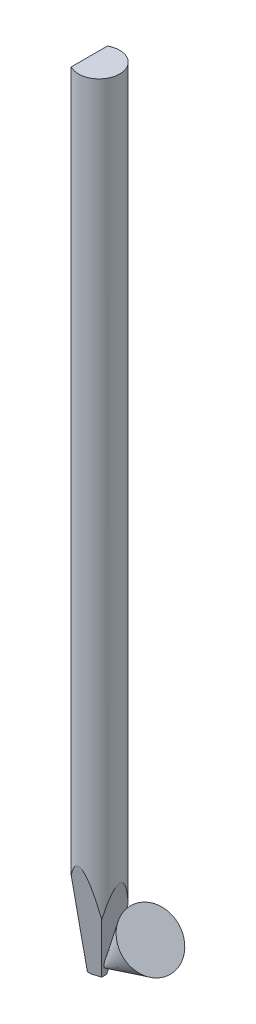
ISO-10303-21;
HEADER;
FILE_DESCRIPTION(('STEP AP214'),'2;1');
FILE_NAME('part.step','',(''),(''),'','','');
FILE_SCHEMA(('AUTOMOTIVE_DESIGN { 1 0 10303 214 1 1 1 1 }'));
ENDSEC;
DATA;
#1=APPLICATION_CONTEXT('core data for automotive mechanical design processes');
#2=APPLICATION_PROTOCOL_DEFINITION('international standard','automotive_design',2000,#1);
#3=PRODUCT_CONTEXT('',#1,'mechanical');
#4=PRODUCT('Part','Part','',(#3));
#5=PRODUCT_RELATED_PRODUCT_CATEGORY('part','',(#4));
#6=PRODUCT_DEFINITION_FORMATION('','',#4);
#7=PRODUCT_DEFINITION_CONTEXT('part definition',#1,'design');
#8=PRODUCT_DEFINITION('design','',#6,#7);
#9=PRODUCT_DEFINITION_SHAPE('','',#8);
#10=(LENGTH_UNIT() NAMED_UNIT(*) SI_UNIT(.MILLI.,.METRE.));
#11=(NAMED_UNIT(*) PLANE_ANGLE_UNIT() SI_UNIT($,.RADIAN.));
#12=(NAMED_UNIT(*) SI_UNIT($,.STERADIAN.) SOLID_ANGLE_UNIT());
#13=UNCERTAINTY_MEASURE_WITH_UNIT(LENGTH_MEASURE(1.E-05),#10,'distance_accuracy_value','');
#14=(GEOMETRIC_REPRESENTATION_CONTEXT(3) GLOBAL_UNCERTAINTY_ASSIGNED_CONTEXT((#13)) GLOBAL_UNIT_ASSIGNED_CONTEXT((#10,
#11,#12)) REPRESENTATION_CONTEXT('',''));
#15=CARTESIAN_POINT('',(0.,0.,0.));
#16=DIRECTION('',(0.,0.,1.));
#17=DIRECTION('',(1.,0.,0.));
#18=AXIS2_PLACEMENT_3D('',#15,#16,#17);
#19=CARTESIAN_POINT('',(0.,0.,0.));
#20=DIRECTION('',(0.,1.,0.));
#21=DIRECTION('',(0.,0.,1.));
#22=AXIS2_PLACEMENT_3D('',#19,#20,#21);
#23=PLANE('',#22);
#24=DIRECTION('',(-1.,0.,0.));
#25=VECTOR('',#24,1.);
#26=CARTESIAN_POINT('',(38.5858213378097,0.,0.0305592719154106));
#27=LINE('',#26,#25);
#28=CARTESIAN_POINT('',(-0.251519873787034,0.,0.0305592719154106));
#29=VERTEX_POINT('',#28);
#30=CARTESIAN_POINT('',(-0.32512,0.,0.0305592719154132));
#31=VERTEX_POINT('',#30);
#32=EDGE_CURVE('E73',#29,#31,#27,.T.);
#33=ORIENTED_EDGE('',*,*,#32,.F.);
#34=CARTESIAN_POINT('',(-0.225245909487751,0.,0.));
#35=DIRECTION('',(0.,1.,0.));
#36=DIRECTION('',(-1.,0.,0.));
#37=AXIS2_PLACEMENT_3D('',#34,#35,#36);
#38=ELLIPSE('',#37,0.0439940905122496,0.0381);
#39=CARTESIAN_POINT('',(-0.2413,0.,0.0354726603649658));
#40=VERTEX_POINT('',#39);
#41=EDGE_CURVE('E66',#40,#29,#38,.F.);
#42=ORIENTED_EDGE('',*,*,#41,.F.);
#43=DIRECTION('',(0.,0.,-1.));
#44=VECTOR('',#43,1.);
#45=CARTESIAN_POINT('',(-0.2413,0.,39.0514777293349));
#46=LINE('',#45,#44);
#47=CARTESIAN_POINT('',(-0.241300000000003,0.,0.0761999999999997));
#48=VERTEX_POINT('',#47);
#49=EDGE_CURVE('E208',#48,#40,#46,.T.);
#50=ORIENTED_EDGE('',*,*,#49,.F.);
#51=DIRECTION('',(-1.,0.,0.));
#52=VECTOR('',#51,1.);
#53=CARTESIAN_POINT('',(38.6493213378097,0.,0.0762));
#54=LINE('',#53,#52);
#55=CARTESIAN_POINT('',(-0.32512,0.,0.0762000000000017));
#56=VERTEX_POINT('',#55);
#57=EDGE_CURVE('E220',#48,#56,#54,.T.);
#58=ORIENTED_EDGE('',*,*,#57,.T.);
#59=DIRECTION('',(0.,0.,-1.));
#60=VECTOR('',#59,1.);
#61=CARTESIAN_POINT('',(-0.32512,0.,38.2746713378097));
#62=LINE('',#61,#60);
#63=EDGE_CURVE('E195',#56,#31,#62,.T.);
#64=ORIENTED_EDGE('',*,*,#63,.T.);
#65=EDGE_LOOP('',(#33,#42,#50,#58,#64));
#66=FACE_BOUND('',#65,.T.);
#67=ADVANCED_FACE('F51',(#66),#23,.F.);
#68=CARTESIAN_POINT('',(38.6493213378097,0.,0.0762));
#69=DIRECTION('',(0.,-0.173648177666931,0.984807753012208));
#70=DIRECTION('',(0.,-0.984807753012208,-0.173648177666931));
#71=AXIS2_PLACEMENT_3D('',#68,#69,#70);
#72=PLANE('',#71);
#73=CARTESIAN_POINT('',(-0.32512,0.0508,0.0851574106199918));
#74=DIRECTION('',(0.,-0.173648177666931,0.984807753012208));
#75=DIRECTION('',(0.,-0.984807753012208,-0.173648177666931));
#76=AXIS2_PLACEMENT_3D('',#73,#74,#75);
#77=ELLIPSE('',#76,0.0515836718837959,0.0508);
#78=CARTESIAN_POINT('',(-0.37592,0.0508,0.0851574106199918));
#79=VERTEX_POINT('',#78);
#80=EDGE_CURVE('E198',#56,#79,#77,.F.);
#81=ORIENTED_EDGE('',*,*,#80,.F.);
#82=ORIENTED_EDGE('',*,*,#57,.F.);
#83=DIRECTION('',(-0.964921520309631,-0.258549942126377,-0.0455893306574928));
#84=VECTOR('',#83,1.);
#85=CARTESIAN_POINT('',(35.9687284956643,9.70244789332123,1.78700334251055));
#86=LINE('',#85,#84);
#87=CARTESIAN_POINT('',(0.195917050620486,0.117151955630876,0.0968570506204847));
#88=VERTEX_POINT('',#87);
#89=EDGE_CURVE('E217',#88,#48,#86,.T.);
#90=ORIENTED_EDGE('',*,*,#89,.F.);
#91=DIRECTION('',(-0.171087869746036,-0.970287525247814,-0.171087869746036));
#92=VECTOR('',#91,1.);
#93=CARTESIAN_POINT('',(1.30143652609224,6.3868644581071,1.20237652609224));
#94=LINE('',#93,#92);
#95=CARTESIAN_POINT('',(0.607704752474526,2.45251606269785,0.508644752474526));
#96=VERTEX_POINT('',#95);
#97=EDGE_CURVE('E214',#96,#88,#94,.T.);
#98=ORIENTED_EDGE('',*,*,#97,.F.);
#99=CARTESIAN_POINT('',(0.,-0.432151674654869,0.));
#100=DIRECTION('',(0.,-0.173648177666931,0.984807753012208));
#101=DIRECTION('',(0.,-0.984807753012208,-0.173648177666931));
#102=AXIS2_PLACEMENT_3D('',#99,#100,#101);
#103=ELLIPSE('',#102,4.56371043248163,0.792479999999998);
#104=CARTESIAN_POINT('',(-0.37592,3.52439037249586,0.69764511322018));
#105=VERTEX_POINT('',#104);
#106=EDGE_CURVE('E226',#96,#105,#103,.T.);
#107=ORIENTED_EDGE('',*,*,#106,.T.);
#108=DIRECTION('',(0.,0.984807753012208,0.173648177666931));
#109=VECTOR('',#108,1.);
#110=CARTESIAN_POINT('',(-0.37592,29.3689259535228,5.25473404003518));
#111=LINE('',#110,#109);
#112=EDGE_CURVE('E241',#79,#105,#111,.T.);
#113=ORIENTED_EDGE('',*,*,#112,.F.);
#114=EDGE_LOOP('',(#81,#82,#90,#98,#107,#113));
#115=FACE_BOUND('',#114,.T.);
#116=ADVANCED_FACE('F296',(#115),#72,.T.);
#117=CARTESIAN_POINT('',(38.6493213378097,0.,-0.0762));
#118=DIRECTION('',(0.,-0.173648177666931,-0.984807753012208));
#119=DIRECTION('',(0.,0.984807753012208,-0.173648177666931));
#120=AXIS2_PLACEMENT_3D('',#117,#118,#119);
#121=PLANE('',#120);
#122=CARTESIAN_POINT('',(-0.32512,0.0508,-0.0851574106199918));
#123=DIRECTION('',(0.,-0.173648177666931,-0.984807753012208));
#124=DIRECTION('',(0.,0.984807753012208,-0.173648177666931));
#125=AXIS2_PLACEMENT_3D('',#122,#123,#124);
#126=ELLIPSE('',#125,0.0515836718837959,0.0508);
#127=CARTESIAN_POINT('',(-0.37592,0.0508,-0.0851574106199918));
#128=VERTEX_POINT('',#127);
#129=CARTESIAN_POINT('',(-0.32512,0.,-0.0761999999999985));
#130=VERTEX_POINT('',#129);
#131=EDGE_CURVE('E252',#128,#130,#126,.F.);
#132=ORIENTED_EDGE('',*,*,#131,.F.);
#133=DIRECTION('',(0.,-0.984807753012208,0.173648177666931));
#134=VECTOR('',#133,1.);
#135=CARTESIAN_POINT('',(-0.37592,29.7268431931102,-5.31784450623514));
#136=LINE('',#135,#134);
#137=CARTESIAN_POINT('',(-0.37592,3.52439037249585,-0.69764511322018));
#138=VERTEX_POINT('',#137);
#139=EDGE_CURVE('E243',#138,#128,#136,.T.);
#140=ORIENTED_EDGE('',*,*,#139,.F.);
#141=CARTESIAN_POINT('',(0.,-0.432151674654869,0.));
#142=DIRECTION('',(0.,-0.173648177666931,-0.984807753012208));
#143=DIRECTION('',(0.,-0.984807753012208,0.173648177666931));
#144=AXIS2_PLACEMENT_3D('',#141,#142,#143);
#145=ELLIPSE('',#144,4.56371043248163,0.792479999999998);
#146=CARTESIAN_POINT('',(0.607704752474526,2.45251606269785,-0.508644752474526));
#147=VERTEX_POINT('',#146);
#148=EDGE_CURVE('E229',#138,#147,#145,.T.);
#149=ORIENTED_EDGE('',*,*,#148,.T.);
#150=DIRECTION('',(0.171087869746036,0.970287525247814,-0.171087869746036));
#151=VECTOR('',#150,1.);
#152=CARTESIAN_POINT('',(1.30143652609224,6.3868644581071,-1.20237652609224));
#153=LINE('',#152,#151);
#154=CARTESIAN_POINT('',(0.195917050620486,0.117151955630876,-0.0968570506204847));
#155=VERTEX_POINT('',#154);
#156=EDGE_CURVE('E246',#155,#147,#153,.T.);
#157=ORIENTED_EDGE('',*,*,#156,.F.);
#158=DIRECTION('',(0.964921520309631,0.258549942126377,-0.0455893306574928));
#159=VECTOR('',#158,1.);
#160=CARTESIAN_POINT('',(35.9687284956643,9.70244789332123,-1.78700334251055));
#161=LINE('',#160,#159);
#162=CARTESIAN_POINT('',(-0.241300000000003,0.,-0.0761999999999997));
#163=VERTEX_POINT('',#162);
#164=EDGE_CURVE('E249',#163,#155,#161,.T.);
#165=ORIENTED_EDGE('',*,*,#164,.F.);
#166=DIRECTION('',(-1.,0.,0.));
#167=VECTOR('',#166,1.);
#168=CARTESIAN_POINT('',(38.6493213378097,0.,-0.0762));
#169=LINE('',#168,#167);
#170=EDGE_CURVE('E223',#163,#130,#169,.T.);
#171=ORIENTED_EDGE('',*,*,#170,.T.);
#172=EDGE_LOOP('',(#132,#140,#149,#157,#165,#171));
#173=FACE_BOUND('',#172,.T.);
#174=ADVANCED_FACE('F302',(#173),#121,.T.);
#175=CARTESIAN_POINT('',(-0.2413,0.,-0.0354726603649658));
#176=VERTEX_POINT('',#175);
#177=EDGE_CURVE('E207',#176,#163,#46,.T.);
#178=ORIENTED_EDGE('',*,*,#177,.F.);
#179=CARTESIAN_POINT('',(-0.251519873787034,0.,-0.0305592719154105));
#180=VERTEX_POINT('',#179);
#181=EDGE_CURVE('E185',#180,#176,#38,.F.);
#182=ORIENTED_EDGE('',*,*,#181,.F.);
#183=DIRECTION('',(-1.,0.,0.));
#184=VECTOR('',#183,1.);
#185=CARTESIAN_POINT('',(38.5858213378097,0.,-0.0305592719154106));
#186=LINE('',#185,#184);
#187=CARTESIAN_POINT('',(-0.325119999999998,0.,-0.0305592719154106));
#188=VERTEX_POINT('',#187);
#189=EDGE_CURVE('E191',#180,#188,#186,.T.);
#190=ORIENTED_EDGE('',*,*,#189,.T.);
#191=EDGE_CURVE('E199',#188,#130,#62,.T.);
#192=ORIENTED_EDGE('',*,*,#191,.T.);
#193=ORIENTED_EDGE('',*,*,#170,.F.);
#194=EDGE_LOOP('',(#178,#182,#190,#192,#193));
#195=FACE_BOUND('',#194,.T.);
#196=ADVANCED_FACE('F298',(#195),#23,.F.);
#197=CARTESIAN_POINT('',(0.,30.48,0.));
#198=DIRECTION('',(0.,-1.,0.));
#199=DIRECTION('',(0.,0.,-1.));
#200=AXIS2_PLACEMENT_3D('',#197,#198,#199);
#201=CYLINDRICAL_SURFACE('',#200,0.792479999999998);
#202=ORIENTED_EDGE('',*,*,#106,.F.);
#203=CARTESIAN_POINT('',(0.,-0.993948851706197,0.));
#204=DIRECTION('',(-0.984807753012208,0.173648177666931,0.));
#205=DIRECTION('',(-0.173648177666931,-0.984807753012208,0.));
#206=AXIS2_PLACEMENT_3D('',#203,#204,#205);
#207=ELLIPSE('',#206,4.56371043248165,0.792479999999998);
#208=EDGE_CURVE('E211',#96,#147,#207,.T.);
#209=ORIENTED_EDGE('',*,*,#208,.T.);
#210=ORIENTED_EDGE('',*,*,#148,.F.);
#211=DIRECTION('',(0.,-1.,0.));
#212=VECTOR('',#211,1.);
#213=CARTESIAN_POINT('',(-0.37592,30.48,-0.69764511322018));
#214=LINE('',#213,#212);
#215=CARTESIAN_POINT('',(-0.37592,30.48,-0.69764511322018));
#216=VERTEX_POINT('',#215);
#217=EDGE_CURVE('E235',#216,#138,#214,.T.);
#218=ORIENTED_EDGE('',*,*,#217,.F.);
#219=CARTESIAN_POINT('',(0.,30.48,0.));
#220=DIRECTION('',(0.,1.,0.));
#221=DIRECTION('',(0.,0.,1.));
#222=AXIS2_PLACEMENT_3D('',#219,#220,#221);
#223=CIRCLE('',#222,0.792479999999998);
#224=CARTESIAN_POINT('',(-0.37592,30.48,0.69764511322018));
#225=VERTEX_POINT('',#224);
#226=EDGE_CURVE('E238',#225,#216,#223,.T.);
#227=ORIENTED_EDGE('',*,*,#226,.F.);
#228=DIRECTION('',(0.,-1.,0.));
#229=VECTOR('',#228,1.);
#230=CARTESIAN_POINT('',(-0.37592,30.48,0.69764511322018));
#231=LINE('',#230,#229);
#232=EDGE_CURVE('E233',#105,#225,#231,.F.);
#233=ORIENTED_EDGE('',*,*,#232,.F.);
#234=EDGE_LOOP('',(#202,#209,#210,#218,#227,#233));
#235=FACE_BOUND('',#234,.T.);
#236=ADVANCED_FACE('F53',(#235),#201,.T.);
#237=CARTESIAN_POINT('',(-0.37592,30.48,-1.04648));
#238=DIRECTION('',(-1.,0.,0.));
#239=DIRECTION('',(0.,0.,1.));
#240=AXIS2_PLACEMENT_3D('',#237,#238,#239);
#241=PLANE('',#240);
#242=DIRECTION('',(0.,0.,-1.));
#243=VECTOR('',#242,1.);
#244=CARTESIAN_POINT('',(-0.37592,0.0508,38.2746713378097));
#245=LINE('',#244,#243);
#246=EDGE_CURVE('E193',#79,#128,#245,.T.);
#247=ORIENTED_EDGE('',*,*,#246,.F.);
#248=ORIENTED_EDGE('',*,*,#112,.T.);
#249=ORIENTED_EDGE('',*,*,#232,.T.);
#250=DIRECTION('',(0.,0.,-1.));
#251=VECTOR('',#250,1.);
#252=CARTESIAN_POINT('',(-0.37592,30.48,-1.04648));
#253=LINE('',#252,#251);
#254=EDGE_CURVE('E231',#225,#216,#253,.T.);
#255=ORIENTED_EDGE('',*,*,#254,.T.);
#256=ORIENTED_EDGE('',*,*,#217,.T.);
#257=ORIENTED_EDGE('',*,*,#139,.T.);
#258=EDGE_LOOP('',(#247,#248,#249,#255,#256,#257));
#259=FACE_BOUND('',#258,.T.);
#260=ADVANCED_FACE('F312',(#259),#241,.T.);
#261=CARTESIAN_POINT('',(0.,30.48,0.));
#262=DIRECTION('',(0.,1.,0.));
#263=DIRECTION('',(0.,0.,1.));
#264=AXIS2_PLACEMENT_3D('',#261,#262,#263);
#265=PLANE('',#264);
#266=ORIENTED_EDGE('',*,*,#226,.T.);
#267=ORIENTED_EDGE('',*,*,#254,.F.);
#268=EDGE_LOOP('',(#266,#267));
#269=FACE_BOUND('',#268,.T.);
#270=ADVANCED_FACE('F344',(#269),#265,.T.);
#271=CARTESIAN_POINT('',(-0.2413,0.,39.0514777293349));
#272=DIRECTION('',(-0.258819045102522,0.965925826289068,0.));
#273=DIRECTION('',(-0.965925826289068,-0.258819045102522,0.));
#274=AXIS2_PLACEMENT_3D('',#271,#272,#273);
#275=PLANE('',#274);
#276=ORIENTED_EDGE('',*,*,#49,.T.);
#277=CARTESIAN_POINT('',(-0.222307807006681,0.00508894277505577,0.));
#278=DIRECTION('',(-0.258819045102522,0.965925826289068,0.));
#279=DIRECTION('',(-0.965925826289068,-0.258819045102522,0.));
#280=AXIS2_PLACEMENT_3D('',#277,#278,#279);
#281=ELLIPSE('',#280,0.0538815367264152,0.0381);
#282=CARTESIAN_POINT('',(-0.222307807006681,0.00508894277505577,0.0380999999999996));
#283=VERTEX_POINT('',#282);
#284=EDGE_CURVE('E190',#40,#283,#281,.T.);
#285=ORIENTED_EDGE('',*,*,#284,.T.);
#286=DIRECTION('',(-0.965925826289068,-0.258819045102522,0.));
#287=VECTOR('',#286,1.);
#288=CARTESIAN_POINT('',(-0.2413,0.,0.0380999999999992));
#289=LINE('',#288,#287);
#290=CARTESIAN_POINT('',(-0.0152400000000001,0.0605725944409798,0.0380999999999996));
#291=VERTEX_POINT('',#290);
#292=EDGE_CURVE('E12',#291,#283,#289,.T.);
#293=ORIENTED_EDGE('',*,*,#292,.F.);
#294=DIRECTION('',(0.,0.,1.));
#295=VECTOR('',#294,1.);
#296=CARTESIAN_POINT('',(-0.0152400000000001,0.0605725944409798,39.0514777293349));
#297=LINE('',#296,#295);
#298=CARTESIAN_POINT('',(-0.0152400000000001,0.0605725944409798,-0.0380999999999996));
#299=VERTEX_POINT('',#298);
#300=EDGE_CURVE('E59',#299,#291,#297,.T.);
#301=ORIENTED_EDGE('',*,*,#300,.F.);
#302=DIRECTION('',(-0.965925826289068,-0.258819045102522,0.));
#303=VECTOR('',#302,1.);
#304=CARTESIAN_POINT('',(-0.2413,0.,-0.0380999999999992));
#305=LINE('',#304,#303);
#306=CARTESIAN_POINT('',(-0.222307807006681,0.0050889427750558,-0.0380999999999996));
#307=VERTEX_POINT('',#306);
#308=EDGE_CURVE('E336',#299,#307,#305,.T.);
#309=ORIENTED_EDGE('',*,*,#308,.T.);
#310=EDGE_CURVE('E187',#307,#176,#281,.T.);
#311=ORIENTED_EDGE('',*,*,#310,.T.);
#312=ORIENTED_EDGE('',*,*,#177,.T.);
#313=ORIENTED_EDGE('',*,*,#164,.T.);
#314=DIRECTION('',(0.,0.,-1.));
#315=VECTOR('',#314,1.);
#316=CARTESIAN_POINT('',(0.195917050620484,0.117151955630877,39.0514777293349));
#317=LINE('',#316,#315);
#318=EDGE_CURVE('E204',#88,#155,#317,.T.);
#319=ORIENTED_EDGE('',*,*,#318,.F.);
#320=ORIENTED_EDGE('',*,*,#89,.T.);
#321=EDGE_LOOP('',(#276,#285,#293,#301,#309,#311,#312,#313,#319,#320));
#322=FACE_BOUND('',#321,.T.);
#323=ADVANCED_FACE('F322',(#322),#275,.F.);
#324=CARTESIAN_POINT('',(0.195917050620484,0.117151955630877,39.0514777293349));
#325=DIRECTION('',(-0.984807753012208,0.173648177666931,0.));
#326=DIRECTION('',(-0.173648177666931,-0.984807753012208,0.));
#327=AXIS2_PLACEMENT_3D('',#324,#325,#326);
#328=PLANE('',#327);
#329=ORIENTED_EDGE('',*,*,#208,.F.);
#330=ORIENTED_EDGE('',*,*,#97,.T.);
#331=ORIENTED_EDGE('',*,*,#318,.T.);
#332=ORIENTED_EDGE('',*,*,#156,.T.);
#333=EDGE_LOOP('',(#329,#330,#331,#332));
#334=FACE_BOUND('',#333,.T.);
#335=ADVANCED_FACE('F328',(#334),#328,.F.);
#336=CARTESIAN_POINT('',(-0.32512,0.0508,38.2746713378097));
#337=DIRECTION('',(0.,0.,-1.));
#338=DIRECTION('',(-1.,0.,0.));
#339=AXIS2_PLACEMENT_3D('',#336,#337,#338);
#340=CYLINDRICAL_SURFACE('',#339,0.0508);
#341=ORIENTED_EDGE('',*,*,#191,.F.);
#342=CARTESIAN_POINT('',(-0.32512,0.,-0.0305592719154107));
#343=CARTESIAN_POINT('',(-0.325858236957676,-5.53108021334955E-07,-0.0305607259657637));
#344=CARTESIAN_POINT('',(-0.326594924621043,1.60714157369838E-05,-0.030495838437188));
#345=CARTESIAN_POINT('',(-0.328040853257545,7.90646741498496E-05,-0.0302458657079433));
#346=CARTESIAN_POINT('',(-0.328750258605012,0.000125209460070392,-0.0300616853651177));
#347=CARTESIAN_POINT('',(-0.330127335420077,0.000242622000986335,-0.0295858263774232));
#348=CARTESIAN_POINT('',(-0.330795098367709,0.000313832226151643,-0.0292943938271016));
#349=CARTESIAN_POINT('',(-0.332081382661914,0.000475060487819713,-0.0286204959071945));
#350=CARTESIAN_POINT('',(-0.33269980461648,0.000565115225959678,-0.0282378526900317));
#351=CARTESIAN_POINT('',(-0.334192076916493,0.000808265513491711,-0.0271773481608598));
#352=CARTESIAN_POINT('',(-0.335029445523832,0.000969625818726419,-0.026449998329407));
#353=CARTESIAN_POINT('',(-0.336575792501105,0.00130219785271696,-0.0248718599859349));
#354=CARTESIAN_POINT('',(-0.337284466615557,0.00147343169781167,-0.0240207873021354));
#355=CARTESIAN_POINT('',(-0.338902404052553,0.00189503390088372,-0.0217907775086764));
#356=CARTESIAN_POINT('',(-0.339738409671651,0.00214281434683637,-0.0203583966577251));
#357=CARTESIAN_POINT('',(-0.341181516405416,0.00260006341315772,-0.0173784393482932));
#358=CARTESIAN_POINT('',(-0.341788196439286,0.00280946119692794,-0.0158306571698745));
#359=CARTESIAN_POINT('',(-0.343030492504762,0.00325551023908127,-0.0119583187225397));
#360=CARTESIAN_POINT('',(-0.343557981079327,0.00346255354596887,-0.00959561821404047));
#361=CARTESIAN_POINT('',(-0.344255063125309,0.00374027266049538,-0.00480965423124057));
#362=CARTESIAN_POINT('',(-0.344424048346478,0.00381071669129823,-0.00238629487582548));
#363=CARTESIAN_POINT('',(-0.344420543476751,0.00380925599007635,0.00251505351649139));
#364=CARTESIAN_POINT('',(-0.344240242551909,0.0037340952025175,0.00499303829877786));
#365=CARTESIAN_POINT('',(-0.343503116072386,0.00344102376156785,0.00988250616835363));
#366=CARTESIAN_POINT('',(-0.342947115283489,0.00322342583000905,0.0122941229082296));
#367=CARTESIAN_POINT('',(-0.341697445915377,0.00277844131593357,0.016056371412867));
#368=CARTESIAN_POINT('',(-0.341140010592968,0.00258733328064085,0.0174568664144533));
#369=CARTESIAN_POINT('',(-0.339836340225262,0.00217343538605201,0.0201631357921833));
#370=CARTESIAN_POINT('',(-0.339090355440518,0.00195068769220773,0.0214690327945598));
#371=CARTESIAN_POINT('',(-0.337609435516471,0.00155498403693321,0.0236026339752404));
#372=CARTESIAN_POINT('',(-0.336924282362182,0.00138453322303943,0.0244651720087413));
#373=CARTESIAN_POINT('',(-0.33542705825125,0.0010507118126494,0.0260748789279711));
#374=CARTESIAN_POINT('',(-0.334615162267625,0.000887331845947955,0.0268222040835302));
#375=CARTESIAN_POINT('',(-0.333082242888472,0.000623459730751616,0.0279875848202924));
#376=CARTESIAN_POINT('',(-0.332389368131792,0.000517464250346877,0.0284412325054634));
#377=CARTESIAN_POINT('',(-0.330938437738328,0.000329027831212182,0.029232356157943));
#378=CARTESIAN_POINT('',(-0.33018056918255,0.000246522055950193,0.0295701524381499));
#379=CARTESIAN_POINT('',(-0.328714108702929,0.000122711503927056,0.0300716782826988));
#380=CARTESIAN_POINT('',(-0.328011633419792,7.74837851241451E-05,0.0302521582460551));
#381=CARTESIAN_POINT('',(-0.326580079595815,1.57536363226463E-05,0.0304970912352569));
#382=CARTESIAN_POINT('',(-0.325850836216604,-5.21850126766476E-07,0.0305606277269008));
#383=CARTESIAN_POINT('',(-0.32512,0.,0.0305592719154108));
#384=B_SPLINE_CURVE_WITH_KNOTS('',3,(#342,#343,#344,#345,#346,#347,#348,#349,#350,#351,#352,
#353,#354,#355,#356,#357,#358,#359,#360,#361,#362,#363,#364,#365,#366,#367,#368,#369,#370,#371,
#372,#373,#374,#375,#376,#377,#378,#379,#380,#381,#382,#383),.UNSPECIFIED.,.F.,.F.,(4,2,2,2,2,2,
2,2,2,2,2,2,2,2,2,2,2,2,2,2,4),(0.,0.00220921601201936,0.0044018679109023,0.00658951973415581,
0.00878147256575863,0.0121249186025338,0.0154761690271903,0.0204789510156342,0.0254908748496787,
0.0327415829903931,0.0400045831488868,0.047431876503932,0.0548429176275208,0.0593900092119095,
0.0639310968754885,0.0672649817656624,0.0705943041604313,0.0730899945258478,0.0755787279534688,
0.0777487809149595,0.0799357702171768),.UNSPECIFIED.);
#385=EDGE_CURVE('E255',#188,#31,#384,.T.);
#386=ORIENTED_EDGE('',*,*,#385,.T.);
#387=ORIENTED_EDGE('',*,*,#63,.F.);
#388=ORIENTED_EDGE('',*,*,#80,.T.);
#389=ORIENTED_EDGE('',*,*,#246,.T.);
#390=ORIENTED_EDGE('',*,*,#131,.T.);
#391=EDGE_LOOP('',(#341,#386,#387,#388,#389,#390));
#392=FACE_BOUND('',#391,.T.);
#393=ADVANCED_FACE('F270',(#392),#340,.T.);
#394=CARTESIAN_POINT('',(38.5858213378097,-0.12065,0.));
#395=DIRECTION('',(-1.,0.,0.));
#396=DIRECTION('',(0.,0.,1.));
#397=AXIS2_PLACEMENT_3D('',#394,#395,#396);
#398=CYLINDRICAL_SURFACE('',#397,0.12446);
#399=ORIENTED_EDGE('',*,*,#189,.F.);
#400=CARTESIAN_POINT('',(-0.251519873787038,0.,-0.0305592719154107));
#401=CARTESIAN_POINT('',(-0.253212442992812,0.000304680277333505,-0.0293578195118916));
#402=CARTESIAN_POINT('',(-0.254799383675205,0.000626134198396242,-0.0280121689503982));
#403=CARTESIAN_POINT('',(-0.25772228329655,0.00126745613152857,-0.0250730883924893));
#404=CARTESIAN_POINT('',(-0.259058423831709,0.00158732512652685,-0.0234798392140403));
#405=CARTESIAN_POINT('',(-0.261443735881515,0.00219118318869465,-0.0200826579826784));
#406=CARTESIAN_POINT('',(-0.262492625766191,0.00247513689763396,-0.018278521623541));
#407=CARTESIAN_POINT('',(-0.264276327290215,0.00297546630576823,-0.0145133409198431));
#408=CARTESIAN_POINT('',(-0.265011238745263,0.00319186347570833,-0.0125523466771001));
#409=CARTESIAN_POINT('',(-0.266147425091763,0.00353264575175171,-0.00854289992266061));
#410=CARTESIAN_POINT('',(-0.266550928152798,0.00365764472370007,-0.00649513048528557));
#411=CARTESIAN_POINT('',(-0.267024809204912,0.00380489792396705,-0.0023572011474007));
#412=CARTESIAN_POINT('',(-0.267095091623122,0.00382712267499358,-0.000267029257816739));
#413=CARTESIAN_POINT('',(-0.266900669145767,0.0037663398511716,0.0039016878755485));
#414=CARTESIAN_POINT('',(-0.266635079230322,0.00368305425671352,0.00598018784627134));
#415=CARTESIAN_POINT('',(-0.265772584262684,0.00341956377513541,0.0100605650870479));
#416=CARTESIAN_POINT('',(-0.265175741462743,0.00323937709880345,0.0120624566785509));
#417=CARTESIAN_POINT('',(-0.263663582323352,0.00280142383734271,0.0159320890412296));
#418=CARTESIAN_POINT('',(-0.262748378895628,0.00254368476179146,0.017799877091425));
#419=CARTESIAN_POINT('',(-0.260620269096897,0.00197844391390526,0.0213491649092957));
#420=CARTESIAN_POINT('',(-0.25940743302166,0.00167095389773039,0.0230307085288325));
#421=CARTESIAN_POINT('',(-0.257097356009015,0.00112927491374232,0.0257180592770446));
#422=CARTESIAN_POINT('',(-0.256064252772083,0.000898918276607413,0.0267805635862541));
#423=CARTESIAN_POINT('',(-0.253878293866173,0.00044290257303953,0.0287722340022557));
#424=CARTESIAN_POINT('',(-0.252725600359476,0.000217237630852924,0.0297015767029099));
#425=CARTESIAN_POINT('',(-0.251519873788958,6.15792915430749E-13,0.0305592719171859));
#426=B_SPLINE_CURVE_WITH_KNOTS('',3,(#400,#401,#402,#403,#404,#405,#406,#407,#408,#409,#410,
#411,#412,#413,#414,#415,#416,#417,#418,#419,#420,#421,#422,#423,#424,#425),.UNSPECIFIED.,.F.,
.F.,(4,2,2,2,2,2,2,2,2,2,2,2,4),(0.,0.00628618282428541,0.0125677963210613,0.0188555466473261,
0.0251412965684637,0.031384431117364,0.0376293561861969,0.0438907709024222,0.0501510093111432,
0.0564090296853914,0.0626655734417439,0.0671546279045663,0.0716376729340544),.UNSPECIFIED.);
#427=EDGE_CURVE('E263',#180,#29,#426,.T.);
#428=ORIENTED_EDGE('',*,*,#427,.T.);
#429=ORIENTED_EDGE('',*,*,#32,.T.);
#430=ORIENTED_EDGE('',*,*,#385,.F.);
#431=EDGE_LOOP('',(#399,#428,#429,#430));
#432=FACE_BOUND('',#431,.T.);
#433=ADVANCED_FACE('F273',(#432),#398,.F.);
#434=CARTESIAN_POINT('',(-0.0152400000000001,0.20828,0.0381));
#435=DIRECTION('',(-1.,0.,0.));
#436=DIRECTION('',(0.,-1.,0.));
#437=AXIS2_PLACEMENT_3D('',#434,#435,#436);
#438=PLANE('',#437);
#439=ORIENTED_EDGE('',*,*,#300,.T.);
#440=DIRECTION('',(0.,1.,0.));
#441=VECTOR('',#440,1.);
#442=CARTESIAN_POINT('',(-0.0152400000000001,0.20828,0.0381));
#443=LINE('',#442,#441);
#444=CARTESIAN_POINT('',(-0.0152400000000001,0.20828,0.0381));
#445=VERTEX_POINT('',#444);
#446=EDGE_CURVE('E152',#291,#445,#443,.T.);
#447=ORIENTED_EDGE('',*,*,#446,.T.);
#448=DIRECTION('',(0.,0.,-1.));
#449=VECTOR('',#448,1.);
#450=CARTESIAN_POINT('',(-0.0152400000000001,0.20828,0.0381));
#451=LINE('',#450,#449);
#452=CARTESIAN_POINT('',(-0.0152400000000001,0.20828,-0.0381));
#453=VERTEX_POINT('',#452);
#454=EDGE_CURVE('E156',#445,#453,#451,.T.);
#455=ORIENTED_EDGE('',*,*,#454,.T.);
#456=DIRECTION('',(0.,1.,0.));
#457=VECTOR('',#456,1.);
#458=CARTESIAN_POINT('',(-0.0152400000000001,0.20828,-0.0381));
#459=LINE('',#458,#457);
#460=EDGE_CURVE('E175',#299,#453,#459,.T.);
#461=ORIENTED_EDGE('',*,*,#460,.F.);
#462=EDGE_LOOP('',(#439,#447,#455,#461));
#463=FACE_BOUND('',#462,.T.);
#464=ADVANCED_FACE('F154',(#463),#438,.T.);
#465=CARTESIAN_POINT('',(0.,0.,0.0381));
#466=DIRECTION('',(0.,0.,-1.));
#467=DIRECTION('',(-1.,0.,0.));
#468=AXIS2_PLACEMENT_3D('',#465,#466,#467);
#469=PLANE('',#468);
#470=ORIENTED_EDGE('',*,*,#292,.T.);
#471=DIRECTION('',(-0.500000000000004,-0.866025403784436,0.));
#472=VECTOR('',#471,1.);
#473=CARTESIAN_POINT('',(-0.168934432115812,0.0975343398574616,0.0381));
#474=LINE('',#473,#472);
#475=CARTESIAN_POINT('',(-0.104995395420934,0.20828,0.0381));
#476=VERTEX_POINT('',#475);
#477=EDGE_CURVE('E170',#476,#283,#474,.T.);
#478=ORIENTED_EDGE('',*,*,#477,.F.);
#479=DIRECTION('',(-1.,0.,0.));
#480=VECTOR('',#479,1.);
#481=CARTESIAN_POINT('',(-0.148989485933184,0.20828,0.0381));
#482=LINE('',#481,#480);
#483=EDGE_CURVE('E162',#445,#476,#482,.T.);
#484=ORIENTED_EDGE('',*,*,#483,.F.);
#485=ORIENTED_EDGE('',*,*,#446,.F.);
#486=EDGE_LOOP('',(#470,#478,#484,#485));
#487=FACE_BOUND('',#486,.T.);
#488=ADVANCED_FACE('F173',(#487),#469,.T.);
#489=CARTESIAN_POINT('',(0.,0.,-0.0381));
#490=DIRECTION('',(0.,0.,-1.));
#491=DIRECTION('',(-1.,0.,0.));
#492=AXIS2_PLACEMENT_3D('',#489,#490,#491);
#493=PLANE('',#492);
#494=ORIENTED_EDGE('',*,*,#460,.T.);
#495=DIRECTION('',(-1.,0.,0.));
#496=VECTOR('',#495,1.);
#497=CARTESIAN_POINT('',(-0.148989485933184,0.20828,-0.0381));
#498=LINE('',#497,#496);
#499=CARTESIAN_POINT('',(-0.104995395420934,0.20828,-0.0381));
#500=VERTEX_POINT('',#499);
#501=EDGE_CURVE('E169',#453,#500,#498,.T.);
#502=ORIENTED_EDGE('',*,*,#501,.T.);
#503=DIRECTION('',(0.500000000000004,0.866025403784436,0.));
#504=VECTOR('',#503,1.);
#505=CARTESIAN_POINT('',(-0.104995395420934,0.20828,-0.0381));
#506=LINE('',#505,#504);
#507=EDGE_CURVE('E181',#307,#500,#506,.T.);
#508=ORIENTED_EDGE('',*,*,#507,.F.);
#509=ORIENTED_EDGE('',*,*,#308,.F.);
#510=EDGE_LOOP('',(#494,#502,#508,#509));
#511=FACE_BOUND('',#510,.T.);
#512=ADVANCED_FACE('F284',(#511),#493,.F.);
#513=CARTESIAN_POINT('',(-0.104995395420934,0.20828,0.));
#514=DIRECTION('',(-0.500000000000004,-0.866025403784436,0.));
#515=DIRECTION('',(0.866025403784437,-0.500000000000004,0.));
#516=AXIS2_PLACEMENT_3D('',#513,#514,#515);
#517=CYLINDRICAL_SURFACE('',#516,0.0381);
#518=ORIENTED_EDGE('',*,*,#41,.T.);
#519=ORIENTED_EDGE('',*,*,#427,.F.);
#520=ORIENTED_EDGE('',*,*,#181,.T.);
#521=ORIENTED_EDGE('',*,*,#310,.F.);
#522=ORIENTED_EDGE('',*,*,#507,.T.);
#523=CARTESIAN_POINT('',(-0.104995395420934,0.20828,0.));
#524=DIRECTION('',(0.,-1.,0.));
#525=DIRECTION('',(-1.,0.,0.));
#526=AXIS2_PLACEMENT_3D('',#523,#524,#525);
#527=ELLIPSE('',#526,0.0439940905122496,0.0381);
#528=EDGE_CURVE('E183',#500,#476,#527,.F.);
#529=ORIENTED_EDGE('',*,*,#528,.T.);
#530=ORIENTED_EDGE('',*,*,#477,.T.);
#531=ORIENTED_EDGE('',*,*,#284,.F.);
#532=EDGE_LOOP('',(#518,#519,#520,#521,#522,#529,#530,#531));
#533=FACE_BOUND('',#532,.T.);
#534=ADVANCED_FACE('F277',(#533),#517,.F.);
#535=CARTESIAN_POINT('',(-0.148989485933184,0.20828,0.0381));
#536=DIRECTION('',(0.,-1.,0.));
#537=DIRECTION('',(0.,0.,-1.));
#538=AXIS2_PLACEMENT_3D('',#535,#536,#537);
#539=PLANE('',#538);
#540=ORIENTED_EDGE('',*,*,#501,.F.);
#541=ORIENTED_EDGE('',*,*,#454,.F.);
#542=ORIENTED_EDGE('',*,*,#483,.T.);
#543=ORIENTED_EDGE('',*,*,#528,.F.);
#544=EDGE_LOOP('',(#540,#541,#542,#543));
#545=FACE_BOUND('',#544,.T.);
#546=ADVANCED_FACE('F166',(#545),#539,.T.);
#547=CLOSED_SHELL('',(#67,#116,#174,#196,#236,#260,#270,#323,#335,#393,#433,#464,#488,#512,#534,#546));
#548=MANIFOLD_SOLID_BREP('B2',#547);
#549=CARTESIAN_POINT('',(0.207817674108744,0.431337674108742,0.));
#550=DIRECTION('',(0.707106781186551,0.707106781186544,0.));
#551=DIRECTION('',(-0.707106781186544,0.707106781186551,0.));
#552=AXIS2_PLACEMENT_3D('',#549,#550,#551);
#553=CONICAL_SURFACE('',#552,0.0444500000000001,0.392699081698725);
#554=CARTESIAN_POINT('',(1.97558109154122,2.1991010915412,0.));
#555=DIRECTION('',(0.707106781186551,0.707106781186544,0.));
#556=DIRECTION('',(-0.707106781186544,0.707106781186551,0.));
#557=AXIS2_PLACEMENT_3D('',#554,#555,#556);
#558=CIRCLE('',#557,1.07998183486493);
#559=CARTESIAN_POINT('',(1.21191861254994,2.96276357053248,0.));
#560=VERTEX_POINT('',#559);
#561=EDGE_CURVE('E50',#560,#560,#558,.T.);
#562=CARTESIAN_POINT('',(0.207817674108744,0.431337674108742,0.));
#563=DIRECTION('',(0.707106781186551,0.707106781186544,0.));
#564=DIRECTION('',(-0.707106781186544,0.707106781186551,0.));
#565=AXIS2_PLACEMENT_3D('',#562,#563,#564);
#566=CIRCLE('',#565,0.0444500000000001);
#567=CARTESIAN_POINT('',(0.176386777685002,0.462768570532484,0.));
#568=VERTEX_POINT('',#567);
#569=EDGE_CURVE('E492',#568,#568,#566,.T.);
#570=CARTESIAN_POINT('',(1.21191861254994,2.96276357053248,0.));
#571=CARTESIAN_POINT('',(1.20113182260343,2.93672195594915,0.));
#572=CARTESIAN_POINT('',(1.19034503265692,2.91068034136581,0.));
#573=CARTESIAN_POINT('',(1.1687714527639,2.85859711219915,0.));
#574=CARTESIAN_POINT('',(1.15798466281739,2.83255549761581,0.));
#575=CARTESIAN_POINT('',(1.13641108292437,2.78047226844915,0.));
#576=CARTESIAN_POINT('',(1.12562429297786,2.75443065386581,0.));
#577=CARTESIAN_POINT('',(1.10405071308484,2.70234742469915,0.));
#578=CARTESIAN_POINT('',(1.09326392313833,2.67630581011581,0.));
#579=CARTESIAN_POINT('',(1.07169034324531,2.62422258094915,0.));
#580=CARTESIAN_POINT('',(1.0609035532988,2.59818096636582,0.));
#581=CARTESIAN_POINT('',(1.03932997340578,2.54609773719915,0.));
#582=CARTESIAN_POINT('',(1.02854318345927,2.52005612261582,0.));
#583=CARTESIAN_POINT('',(1.00696960356625,2.46797289344915,0.));
#584=CARTESIAN_POINT('',(0.996182813619744,2.44193127886582,0.));
#585=CARTESIAN_POINT('',(0.974609233726724,2.38984804969915,0.));
#586=CARTESIAN_POINT('',(0.963822443780214,2.36380643511581,0.));
#587=CARTESIAN_POINT('',(0.942248863887195,2.31172320594915,0.));
#588=CARTESIAN_POINT('',(0.931462073940685,2.28568159136582,0.));
#589=CARTESIAN_POINT('',(0.909888494047666,2.23359836219915,0.));
#590=CARTESIAN_POINT('',(0.899101704101156,2.20755674761582,0.));
#591=CARTESIAN_POINT('',(0.877528124208136,2.15547351844915,0.));
#592=CARTESIAN_POINT('',(0.866741334261626,2.12943190386582,0.));
#593=CARTESIAN_POINT('',(0.845167754368607,2.07734867469915,0.));
#594=CARTESIAN_POINT('',(0.834380964422097,2.05130706011582,0.));
#595=CARTESIAN_POINT('',(0.812807384529078,1.99922383094915,0.));
#596=CARTESIAN_POINT('',(0.802020594582568,1.97318221636582,0.));
#597=CARTESIAN_POINT('',(0.780447014689548,1.92109898719915,0.));
#598=CARTESIAN_POINT('',(0.769660224743039,1.89505737261582,0.));
#599=CARTESIAN_POINT('',(0.748086644850019,1.84297414344915,0.));
#600=CARTESIAN_POINT('',(0.737299854903509,1.81693252886582,0.));
#601=CARTESIAN_POINT('',(0.71572627501049,1.76484929969915,0.));
#602=CARTESIAN_POINT('',(0.70493948506398,1.73880768511582,0.));
#603=CARTESIAN_POINT('',(0.683365905170961,1.68672445594915,0.));
#604=CARTESIAN_POINT('',(0.672579115224451,1.66068284136582,0.));
#605=CARTESIAN_POINT('',(0.651005535331431,1.60859961219915,0.));
#606=CARTESIAN_POINT('',(0.640218745384921,1.58255799761582,0.));
#607=CARTESIAN_POINT('',(0.618645165491902,1.53047476844915,0.));
#608=CARTESIAN_POINT('',(0.607858375545392,1.50443315386582,0.));
#609=CARTESIAN_POINT('',(0.586284795652372,1.45234992469915,0.));
#610=CARTESIAN_POINT('',(0.575498005705863,1.42630831011582,0.));
#611=CARTESIAN_POINT('',(0.553924425812843,1.37422508094915,0.));
#612=CARTESIAN_POINT('',(0.543137635866334,1.34818346636582,0.));
#613=CARTESIAN_POINT('',(0.521564055973314,1.29610023719915,0.));
#614=CARTESIAN_POINT('',(0.510777266026804,1.27005862261582,0.));
#615=CARTESIAN_POINT('',(0.489203686133785,1.21797539344915,0.));
#616=CARTESIAN_POINT('',(0.478416896187275,1.19193377886582,0.));
#617=CARTESIAN_POINT('',(0.456843316294255,1.13985054969915,0.));
#618=CARTESIAN_POINT('',(0.446056526347746,1.11380893511582,0.));
#619=CARTESIAN_POINT('',(0.424482946454726,1.06172570594915,0.));
#620=CARTESIAN_POINT('',(0.413696156508217,1.03568409136582,0.));
#621=CARTESIAN_POINT('',(0.392122576615197,0.98360086219915,0.));
#622=CARTESIAN_POINT('',(0.381335786668687,0.957559247615816,0.));
#623=CARTESIAN_POINT('',(0.359762206775668,0.90547601844915,0.));
#624=CARTESIAN_POINT('',(0.348975416829158,0.879434403865817,0.));
#625=CARTESIAN_POINT('',(0.327401836936138,0.82735117469915,0.));
#626=CARTESIAN_POINT('',(0.316615046989629,0.801309560115817,0.));
#627=CARTESIAN_POINT('',(0.295041467096609,0.74922633094915,0.));
#628=CARTESIAN_POINT('',(0.284254677150099,0.723184716365817,0.));
#629=CARTESIAN_POINT('',(0.26268109725708,0.67110148719915,0.));
#630=CARTESIAN_POINT('',(0.25189430731057,0.645059872615817,0.));
#631=CARTESIAN_POINT('',(0.23032072741755,0.59297664344915,0.));
#632=CARTESIAN_POINT('',(0.219533937471041,0.566935028865817,0.));
#633=CARTESIAN_POINT('',(0.197960357578021,0.514851799699151,0.));
#634=CARTESIAN_POINT('',(0.187173567631511,0.488810185115817,0.));
#635=CARTESIAN_POINT('',(0.176386777685002,0.462768570532484,0.));
#636=B_SPLINE_CURVE_WITH_KNOTS('',3,(#570,#571,#572,#573,#574,#575,#576,#577,#578,#579,#580,
#581,#582,#583,#584,#585,#586,#587,#588,#589,#590,#591,#592,#593,#594,#595,#596,#597,#598,#599,
#600,#601,#602,#603,#604,#605,#606,#607,#608,#609,#610,#611,#612,#613,#614,#615,#616,#617,#618,
#619,#620,#621,#622,#623,#624,#625,#626,#627,#628,#629,#630,#631,#632,#633,#634,#635),
.UNSPECIFIED.,.F.,.F.,(4,2,2,2,2,2,2,2,2,2,2,2,2,2,2,2,2,2,2,2,2,2,2,2,2,2,2,2,2,2,2,2,4),(0.,
0.084561721524062,0.169123443048124,0.253685164572186,0.338246886096248,0.42280860762031,
0.507370329144372,0.591932050668434,0.676493772192497,0.761055493716558,0.84561721524062,
0.930178936764682,1.01474065828874,1.09930237981281,1.18386410133687,1.26842582286093,
1.35298754438499,1.43754926590905,1.52211098743312,1.60667270895718,1.69123443048124,
1.7757961520053,1.86035787352936,1.94491959505343,2.02948131657749,2.11404303810155,
2.19860475962561,2.28316648114968,2.36772820267374,2.4522899241978,2.53685164572186,
2.62141336724592,2.70597508876999),.UNSPECIFIED.);
#637=EDGE_CURVE('BSEAM486',#560,#568,#636,.T.);
#638=ORIENTED_EDGE('',*,*,#561,.F.);
#639=ORIENTED_EDGE('',*,*,#569,.T.);
#640=ORIENTED_EDGE('',*,*,#637,.T.);
#641=ORIENTED_EDGE('',*,*,#637,.F.);
#642=EDGE_LOOP('',(#638,#640,#639,#641));
#643=FACE_BOUND('',#642,.T.);
#644=ADVANCED_FACE('F486',(#643),#553,.T.);
#645=CARTESIAN_POINT('',(1.97558109154122,2.1991010915412,0.));
#646=DIRECTION('',(0.707106781186551,0.707106781186544,0.));
#647=DIRECTION('',(-0.707106781186544,0.707106781186551,0.));
#648=AXIS2_PLACEMENT_3D('',#645,#646,#647);
#649=PLANE('',#648);
#650=ORIENTED_EDGE('',*,*,#561,.T.);
#651=EDGE_LOOP('',(#650));
#652=FACE_BOUND('',#651,.T.);
#653=ADVANCED_FACE('F501',(#652),#649,.T.);
#654=CARTESIAN_POINT('',(0.207817674108744,0.431337674108742,0.));
#655=DIRECTION('',(0.707106781186551,0.707106781186544,0.));
#656=DIRECTION('',(-0.707106781186544,0.707106781186551,0.));
#657=AXIS2_PLACEMENT_3D('',#654,#655,#656);
#658=PLANE('',#657);
#659=ORIENTED_EDGE('',*,*,#569,.F.);
#660=EDGE_LOOP('',(#659));
#661=FACE_BOUND('',#660,.T.);
#662=ADVANCED_FACE('F499',(#661),#658,.F.);
#663=CLOSED_SHELL('',(#644,#653,#662));
#664=MANIFOLD_SOLID_BREP('B6',#663);
#665=ADVANCED_BREP_SHAPE_REPRESENTATION('',(#18,#548,#664),#14);
#666=SHAPE_DEFINITION_REPRESENTATION(#9,#665);
ENDSEC;
END-ISO-10303-21;
